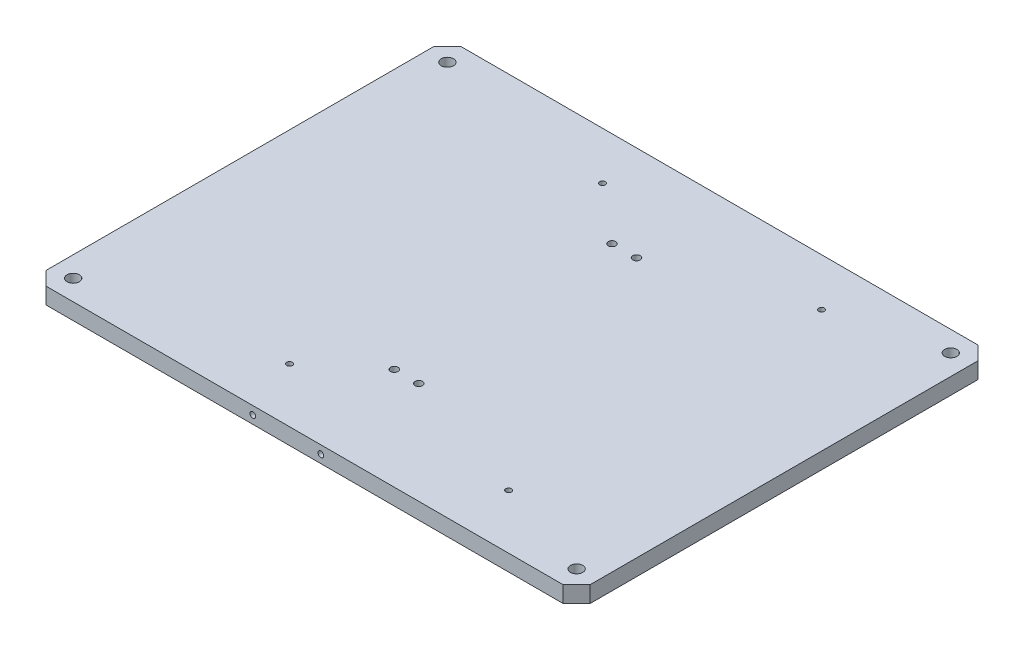
ISO-10303-21;
HEADER;
FILE_DESCRIPTION(('STEP AP214'),'2;1');
FILE_NAME('part.step','',(''),(''),'','','');
FILE_SCHEMA(('AUTOMOTIVE_DESIGN { 1 0 10303 214 1 1 1 1 }'));
ENDSEC;
DATA;
#1=APPLICATION_CONTEXT('core data for automotive mechanical design processes');
#2=APPLICATION_PROTOCOL_DEFINITION('international standard','automotive_design',2000,#1);
#3=PRODUCT_CONTEXT('',#1,'mechanical');
#4=PRODUCT('Part','Part','',(#3));
#5=PRODUCT_RELATED_PRODUCT_CATEGORY('part','',(#4));
#6=PRODUCT_DEFINITION_FORMATION('','',#4);
#7=PRODUCT_DEFINITION_CONTEXT('part definition',#1,'design');
#8=PRODUCT_DEFINITION('design','',#6,#7);
#9=PRODUCT_DEFINITION_SHAPE('','',#8);
#10=(LENGTH_UNIT() NAMED_UNIT(*) SI_UNIT(.MILLI.,.METRE.));
#11=(NAMED_UNIT(*) PLANE_ANGLE_UNIT() SI_UNIT($,.RADIAN.));
#12=(NAMED_UNIT(*) SI_UNIT($,.STERADIAN.) SOLID_ANGLE_UNIT());
#13=UNCERTAINTY_MEASURE_WITH_UNIT(LENGTH_MEASURE(1.E-05),#10,'distance_accuracy_value','');
#14=(GEOMETRIC_REPRESENTATION_CONTEXT(3) GLOBAL_UNCERTAINTY_ASSIGNED_CONTEXT((#13)) GLOBAL_UNIT_ASSIGNED_CONTEXT((#10,
#11,#12)) REPRESENTATION_CONTEXT('',''));
#15=CARTESIAN_POINT('',(0.,0.,0.));
#16=DIRECTION('',(0.,0.,1.));
#17=DIRECTION('',(1.,0.,0.));
#18=AXIS2_PLACEMENT_3D('',#15,#16,#17);
#19=CARTESIAN_POINT('',(-200.,12.,0.));
#20=DIRECTION('',(1.,0.,0.));
#21=DIRECTION('',(0.,0.,-1.));
#22=AXIS2_PLACEMENT_3D('',#19,#20,#21);
#23=PLANE('',#22);
#24=DIRECTION('',(0.,0.,1.));
#25=VECTOR('',#24,1.);
#26=CARTESIAN_POINT('',(-200.,0.,0.));
#27=LINE('',#26,#25);
#28=CARTESIAN_POINT('',(-200.,0.,10.0000000000001));
#29=VERTEX_POINT('',#28);
#30=CARTESIAN_POINT('',(-200.,0.,295.));
#31=VERTEX_POINT('',#30);
#32=EDGE_CURVE('E177',#29,#31,#27,.T.);
#33=ORIENTED_EDGE('',*,*,#32,.T.);
#34=DIRECTION('',(0.,1.,0.));
#35=VECTOR('',#34,1.);
#36=CARTESIAN_POINT('',(-200.,12.,295.));
#37=LINE('',#36,#35);
#38=CARTESIAN_POINT('',(-200.,12.,295.));
#39=VERTEX_POINT('',#38);
#40=EDGE_CURVE('E226',#31,#39,#37,.T.);
#41=ORIENTED_EDGE('',*,*,#40,.T.);
#42=DIRECTION('',(0.,0.,1.));
#43=VECTOR('',#42,1.);
#44=CARTESIAN_POINT('',(-200.,12.,0.));
#45=LINE('',#44,#43);
#46=CARTESIAN_POINT('',(-200.,12.,10.0000000000001));
#47=VERTEX_POINT('',#46);
#48=EDGE_CURVE('E178',#47,#39,#45,.T.);
#49=ORIENTED_EDGE('',*,*,#48,.F.);
#50=DIRECTION('',(0.,-1.,0.));
#51=VECTOR('',#50,1.);
#52=CARTESIAN_POINT('',(-200.,12.,10.0000000000001));
#53=LINE('',#52,#51);
#54=EDGE_CURVE('E223',#47,#29,#53,.T.);
#55=ORIENTED_EDGE('',*,*,#54,.T.);
#56=EDGE_LOOP('',(#33,#41,#49,#55));
#57=FACE_BOUND('',#56,.T.);
#58=ADVANCED_FACE('F36',(#57),#23,.F.);
#59=CARTESIAN_POINT('',(-200.,12.,305.));
#60=DIRECTION('',(0.,0.,-1.));
#61=DIRECTION('',(-1.,0.,0.));
#62=AXIS2_PLACEMENT_3D('',#59,#60,#61);
#63=PLANE('',#62);
#64=CARTESIAN_POINT('',(-38.,5.99999999999999,305.));
#65=DIRECTION('',(0.,0.,1.));
#66=DIRECTION('',(1.,0.,0.));
#67=AXIS2_PLACEMENT_3D('',#64,#65,#66);
#68=CIRCLE('',#67,2.09999999999999);
#69=CARTESIAN_POINT('',(-35.9,5.99999999999999,305.));
#70=VERTEX_POINT('',#69);
#71=EDGE_CURVE('E117',#70,#70,#68,.T.);
#72=ORIENTED_EDGE('',*,*,#71,.F.);
#73=EDGE_LOOP('',(#72));
#74=FACE_BOUND('',#73,.T.);
#75=CARTESIAN_POINT('',(12.0000000000001,6.,305.));
#76=DIRECTION('',(0.,0.,1.));
#77=DIRECTION('',(1.,0.,0.));
#78=AXIS2_PLACEMENT_3D('',#75,#76,#77);
#79=CIRCLE('',#78,2.09999999999999);
#80=CARTESIAN_POINT('',(14.1,6.,305.));
#81=VERTEX_POINT('',#80);
#82=EDGE_CURVE('E116',#81,#81,#79,.T.);
#83=ORIENTED_EDGE('',*,*,#82,.F.);
#84=EDGE_LOOP('',(#83));
#85=FACE_BOUND('',#84,.T.);
#86=DIRECTION('',(1.,0.,0.));
#87=VECTOR('',#86,1.);
#88=CARTESIAN_POINT('',(-200.,0.,305.));
#89=LINE('',#88,#87);
#90=CARTESIAN_POINT('',(-190.,0.,305.));
#91=VERTEX_POINT('',#90);
#92=CARTESIAN_POINT('',(190.,0.,305.));
#93=VERTEX_POINT('',#92);
#94=EDGE_CURVE('E192',#91,#93,#89,.T.);
#95=ORIENTED_EDGE('',*,*,#94,.T.);
#96=DIRECTION('',(0.,1.,0.));
#97=VECTOR('',#96,1.);
#98=CARTESIAN_POINT('',(190.,12.,305.));
#99=LINE('',#98,#97);
#100=CARTESIAN_POINT('',(190.,12.,305.));
#101=VERTEX_POINT('',#100);
#102=EDGE_CURVE('E214',#93,#101,#99,.T.);
#103=ORIENTED_EDGE('',*,*,#102,.T.);
#104=DIRECTION('',(1.,0.,0.));
#105=VECTOR('',#104,1.);
#106=CARTESIAN_POINT('',(-200.,12.,305.));
#107=LINE('',#106,#105);
#108=CARTESIAN_POINT('',(-190.,12.,305.));
#109=VERTEX_POINT('',#108);
#110=EDGE_CURVE('E181',#109,#101,#107,.T.);
#111=ORIENTED_EDGE('',*,*,#110,.F.);
#112=DIRECTION('',(0.,-1.,0.));
#113=VECTOR('',#112,1.);
#114=CARTESIAN_POINT('',(-190.,12.,305.));
#115=LINE('',#114,#113);
#116=EDGE_CURVE('E211',#109,#91,#115,.T.);
#117=ORIENTED_EDGE('',*,*,#116,.T.);
#118=EDGE_LOOP('',(#95,#103,#111,#117));
#119=FACE_BOUND('',#118,.T.);
#120=ADVANCED_FACE('F241',(#74,#85,#119),#63,.F.);
#121=CARTESIAN_POINT('',(200.,12.,0.));
#122=DIRECTION('',(-1.,0.,0.));
#123=DIRECTION('',(0.,0.,1.));
#124=AXIS2_PLACEMENT_3D('',#121,#122,#123);
#125=PLANE('',#124);
#126=DIRECTION('',(0.,0.,-1.));
#127=VECTOR('',#126,1.);
#128=CARTESIAN_POINT('',(200.,12.,0.));
#129=LINE('',#128,#127);
#130=CARTESIAN_POINT('',(200.,12.,295.));
#131=VERTEX_POINT('',#130);
#132=CARTESIAN_POINT('',(200.,12.,10.));
#133=VERTEX_POINT('',#132);
#134=EDGE_CURVE('E185',#131,#133,#129,.T.);
#135=ORIENTED_EDGE('',*,*,#134,.F.);
#136=DIRECTION('',(0.,-1.,0.));
#137=VECTOR('',#136,1.);
#138=CARTESIAN_POINT('',(200.,12.,295.));
#139=LINE('',#138,#137);
#140=CARTESIAN_POINT('',(200.,0.,295.));
#141=VERTEX_POINT('',#140);
#142=EDGE_CURVE('E200',#131,#141,#139,.T.);
#143=ORIENTED_EDGE('',*,*,#142,.T.);
#144=DIRECTION('',(0.,0.,-1.));
#145=VECTOR('',#144,1.);
#146=CARTESIAN_POINT('',(200.,0.,0.));
#147=LINE('',#146,#145);
#148=CARTESIAN_POINT('',(200.,0.,9.99999999999991));
#149=VERTEX_POINT('',#148);
#150=EDGE_CURVE('E195',#141,#149,#147,.T.);
#151=ORIENTED_EDGE('',*,*,#150,.T.);
#152=DIRECTION('',(0.,1.,0.));
#153=VECTOR('',#152,1.);
#154=CARTESIAN_POINT('',(200.,12.,9.99999999999991));
#155=LINE('',#154,#153);
#156=EDGE_CURVE('E189',#149,#133,#155,.T.);
#157=ORIENTED_EDGE('',*,*,#156,.T.);
#158=EDGE_LOOP('',(#135,#143,#151,#157));
#159=FACE_BOUND('',#158,.T.);
#160=ADVANCED_FACE('F252',(#159),#125,.F.);
#161=CARTESIAN_POINT('',(-200.,12.,0.));
#162=DIRECTION('',(0.,0.,1.));
#163=DIRECTION('',(1.,0.,0.));
#164=AXIS2_PLACEMENT_3D('',#161,#162,#163);
#165=PLANE('',#164);
#166=DIRECTION('',(-1.,0.,0.));
#167=VECTOR('',#166,1.);
#168=CARTESIAN_POINT('',(-200.,12.,0.));
#169=LINE('',#168,#167);
#170=CARTESIAN_POINT('',(190.,12.,0.));
#171=VERTEX_POINT('',#170);
#172=CARTESIAN_POINT('',(-190.,12.,0.));
#173=VERTEX_POINT('',#172);
#174=EDGE_CURVE('E187',#171,#173,#169,.T.);
#175=ORIENTED_EDGE('',*,*,#174,.F.);
#176=DIRECTION('',(0.,-1.,0.));
#177=VECTOR('',#176,1.);
#178=CARTESIAN_POINT('',(190.,12.,0.));
#179=LINE('',#178,#177);
#180=CARTESIAN_POINT('',(190.,0.,0.));
#181=VERTEX_POINT('',#180);
#182=EDGE_CURVE('E11',#171,#181,#179,.T.);
#183=ORIENTED_EDGE('',*,*,#182,.T.);
#184=DIRECTION('',(-1.,0.,0.));
#185=VECTOR('',#184,1.);
#186=CARTESIAN_POINT('',(-200.,0.,0.));
#187=LINE('',#186,#185);
#188=CARTESIAN_POINT('',(-190.,0.,0.));
#189=VERTEX_POINT('',#188);
#190=EDGE_CURVE('E182',#181,#189,#187,.T.);
#191=ORIENTED_EDGE('',*,*,#190,.T.);
#192=DIRECTION('',(0.,1.,0.));
#193=VECTOR('',#192,1.);
#194=CARTESIAN_POINT('',(-190.,12.,0.));
#195=LINE('',#194,#193);
#196=EDGE_CURVE('E44',#189,#173,#195,.T.);
#197=ORIENTED_EDGE('',*,*,#196,.T.);
#198=EDGE_LOOP('',(#175,#183,#191,#197));
#199=FACE_BOUND('',#198,.T.);
#200=ADVANCED_FACE('F258',(#199),#165,.F.);
#201=CARTESIAN_POINT('',(-200.,12.,305.));
#202=DIRECTION('',(0.,1.,0.));
#203=DIRECTION('',(0.,0.,1.));
#204=AXIS2_PLACEMENT_3D('',#201,#202,#203);
#205=PLANE('',#204);
#206=CARTESIAN_POINT('',(-51.,12.,265.));
#207=DIRECTION('',(0.,1.,0.));
#208=DIRECTION('',(0.,0.,1.));
#209=AXIS2_PLACEMENT_3D('',#206,#207,#208);
#210=CIRCLE('',#209,2.1);
#211=CARTESIAN_POINT('',(-51.,12.,267.1));
#212=VERTEX_POINT('',#211);
#213=EDGE_CURVE('E639',#212,#212,#210,.T.);
#214=ORIENTED_EDGE('',*,*,#213,.F.);
#215=EDGE_LOOP('',(#214));
#216=FACE_BOUND('',#215,.T.);
#217=CARTESIAN_POINT('',(-51.,12.,35.));
#218=DIRECTION('',(0.,1.,0.));
#219=DIRECTION('',(0.,0.,1.));
#220=AXIS2_PLACEMENT_3D('',#217,#218,#219);
#221=CIRCLE('',#220,2.1);
#222=CARTESIAN_POINT('',(-51.,12.,37.1));
#223=VERTEX_POINT('',#222);
#224=EDGE_CURVE('E641',#223,#223,#221,.T.);
#225=ORIENTED_EDGE('',*,*,#224,.F.);
#226=EDGE_LOOP('',(#225));
#227=FACE_BOUND('',#226,.T.);
#228=CARTESIAN_POINT('',(110.,12.,265.));
#229=DIRECTION('',(0.,1.,0.));
#230=DIRECTION('',(0.,0.,1.));
#231=AXIS2_PLACEMENT_3D('',#228,#229,#230);
#232=CIRCLE('',#231,2.1);
#233=CARTESIAN_POINT('',(110.,12.,267.1));
#234=VERTEX_POINT('',#233);
#235=EDGE_CURVE('E649',#234,#234,#232,.T.);
#236=ORIENTED_EDGE('',*,*,#235,.F.);
#237=EDGE_LOOP('',(#236));
#238=FACE_BOUND('',#237,.T.);
#239=CARTESIAN_POINT('',(110.,12.,35.));
#240=DIRECTION('',(0.,1.,0.));
#241=DIRECTION('',(0.,0.,1.));
#242=AXIS2_PLACEMENT_3D('',#239,#240,#241);
#243=CIRCLE('',#242,2.1);
#244=CARTESIAN_POINT('',(110.,12.,37.1));
#245=VERTEX_POINT('',#244);
#246=EDGE_CURVE('E655',#245,#245,#243,.T.);
#247=ORIENTED_EDGE('',*,*,#246,.F.);
#248=EDGE_LOOP('',(#247));
#249=FACE_BOUND('',#248,.T.);
#250=CARTESIAN_POINT('',(-185.,12.,290.));
#251=DIRECTION('',(0.,1.,0.));
#252=DIRECTION('',(0.,0.,1.));
#253=AXIS2_PLACEMENT_3D('',#250,#251,#252);
#254=CIRCLE('',#253,4.49999999999998);
#255=CARTESIAN_POINT('',(-185.,12.,294.5));
#256=VERTEX_POINT('',#255);
#257=EDGE_CURVE('E661',#256,#256,#254,.T.);
#258=ORIENTED_EDGE('',*,*,#257,.F.);
#259=EDGE_LOOP('',(#258));
#260=FACE_BOUND('',#259,.T.);
#261=CARTESIAN_POINT('',(-185.,12.,15.));
#262=DIRECTION('',(0.,1.,0.));
#263=DIRECTION('',(0.,0.,1.));
#264=AXIS2_PLACEMENT_3D('',#261,#262,#263);
#265=CIRCLE('',#264,4.49999999999998);
#266=CARTESIAN_POINT('',(-185.,12.,19.4999999999999));
#267=VERTEX_POINT('',#266);
#268=EDGE_CURVE('E667',#267,#267,#265,.T.);
#269=ORIENTED_EDGE('',*,*,#268,.F.);
#270=EDGE_LOOP('',(#269));
#271=FACE_BOUND('',#270,.T.);
#272=CARTESIAN_POINT('',(185.,12.,15.));
#273=DIRECTION('',(0.,1.,0.));
#274=DIRECTION('',(0.,0.,1.));
#275=AXIS2_PLACEMENT_3D('',#272,#273,#274);
#276=CIRCLE('',#275,4.49999999999998);
#277=CARTESIAN_POINT('',(185.,12.,19.5));
#278=VERTEX_POINT('',#277);
#279=EDGE_CURVE('E673',#278,#278,#276,.T.);
#280=ORIENTED_EDGE('',*,*,#279,.F.);
#281=EDGE_LOOP('',(#280));
#282=FACE_BOUND('',#281,.T.);
#283=CARTESIAN_POINT('',(185.,12.,290.));
#284=DIRECTION('',(0.,1.,0.));
#285=DIRECTION('',(0.,0.,1.));
#286=AXIS2_PLACEMENT_3D('',#283,#284,#285);
#287=CIRCLE('',#286,4.49999999999998);
#288=CARTESIAN_POINT('',(185.,12.,294.5));
#289=VERTEX_POINT('',#288);
#290=EDGE_CURVE('E679',#289,#289,#287,.T.);
#291=ORIENTED_EDGE('',*,*,#290,.F.);
#292=EDGE_LOOP('',(#291));
#293=FACE_BOUND('',#292,.T.);
#294=CARTESIAN_POINT('',(-9.00000000000003,12.,230.));
#295=DIRECTION('',(0.,-1.,0.));
#296=DIRECTION('',(0.,0.,-1.));
#297=AXIS2_PLACEMENT_3D('',#294,#295,#296);
#298=CIRCLE('',#297,2.75);
#299=CARTESIAN_POINT('',(-9.00000000000003,12.,227.25));
#300=VERTEX_POINT('',#299);
#301=EDGE_CURVE('E138',#300,#300,#298,.T.);
#302=ORIENTED_EDGE('',*,*,#301,.T.);
#303=EDGE_LOOP('',(#302));
#304=FACE_BOUND('',#303,.T.);
#305=CARTESIAN_POINT('',(-9.00000000000003,12.,70.));
#306=DIRECTION('',(0.,-1.,0.));
#307=DIRECTION('',(0.,0.,-1.));
#308=AXIS2_PLACEMENT_3D('',#305,#306,#307);
#309=CIRCLE('',#308,2.75);
#310=CARTESIAN_POINT('',(-9.00000000000003,12.,67.25));
#311=VERTEX_POINT('',#310);
#312=EDGE_CURVE('E150',#311,#311,#309,.T.);
#313=ORIENTED_EDGE('',*,*,#312,.T.);
#314=EDGE_LOOP('',(#313));
#315=FACE_BOUND('',#314,.T.);
#316=CARTESIAN_POINT('',(9.00000000000001,12.,70.));
#317=DIRECTION('',(0.,-1.,0.));
#318=DIRECTION('',(0.,0.,-1.));
#319=AXIS2_PLACEMENT_3D('',#316,#317,#318);
#320=CIRCLE('',#319,2.75);
#321=CARTESIAN_POINT('',(9.00000000000001,12.,67.25));
#322=VERTEX_POINT('',#321);
#323=EDGE_CURVE('E162',#322,#322,#320,.T.);
#324=ORIENTED_EDGE('',*,*,#323,.T.);
#325=EDGE_LOOP('',(#324));
#326=FACE_BOUND('',#325,.T.);
#327=CARTESIAN_POINT('',(8.99999999999997,12.,230.));
#328=DIRECTION('',(0.,-1.,0.));
#329=DIRECTION('',(0.,0.,-1.));
#330=AXIS2_PLACEMENT_3D('',#327,#328,#329);
#331=CIRCLE('',#330,2.75);
#332=CARTESIAN_POINT('',(8.99999999999997,12.,227.25));
#333=VERTEX_POINT('',#332);
#334=EDGE_CURVE('E174',#333,#333,#331,.T.);
#335=ORIENTED_EDGE('',*,*,#334,.T.);
#336=EDGE_LOOP('',(#335));
#337=FACE_BOUND('',#336,.T.);
#338=ORIENTED_EDGE('',*,*,#110,.T.);
#339=DIRECTION('',(-0.707106781186551,0.,0.707106781186544));
#340=VECTOR('',#339,1.);
#341=CARTESIAN_POINT('',(-5.00000000000211,12.,500.));
#342=LINE('',#341,#340);
#343=EDGE_CURVE('E221',#101,#131,#342,.F.);
#344=ORIENTED_EDGE('',*,*,#343,.T.);
#345=ORIENTED_EDGE('',*,*,#134,.T.);
#346=DIRECTION('',(0.707106781186548,0.,0.707106781186548));
#347=VECTOR('',#346,1.);
#348=CARTESIAN_POINT('',(147.5,12.,-42.5));
#349=LINE('',#348,#347);
#350=EDGE_CURVE('E57',#133,#171,#349,.F.);
#351=ORIENTED_EDGE('',*,*,#350,.T.);
#352=ORIENTED_EDGE('',*,*,#174,.T.);
#353=DIRECTION('',(0.707106781186546,0.,-0.707106781186549));
#354=VECTOR('',#353,1.);
#355=CARTESIAN_POINT('',(-347.5,12.,157.500000000001));
#356=LINE('',#355,#354);
#357=EDGE_CURVE('E216',#173,#47,#356,.F.);
#358=ORIENTED_EDGE('',*,*,#357,.T.);
#359=ORIENTED_EDGE('',*,*,#48,.T.);
#360=DIRECTION('',(-0.707106781186549,0.,-0.707106781186546));
#361=VECTOR('',#360,1.);
#362=CARTESIAN_POINT('',(-195.,12.,300.));
#363=LINE('',#362,#361);
#364=EDGE_CURVE('E219',#39,#109,#363,.F.);
#365=ORIENTED_EDGE('',*,*,#364,.T.);
#366=EDGE_LOOP('',(#338,#344,#345,#351,#352,#358,#359,#365));
#367=FACE_BOUND('',#366,.T.);
#368=ADVANCED_FACE('F234',(#216,#227,#238,#249,#260,#271,#282,#293,#304,#315,#326,#337,#367),
#205,.T.);
#369=CARTESIAN_POINT('',(-200.,0.,305.));
#370=DIRECTION('',(0.,1.,0.));
#371=DIRECTION('',(0.,0.,1.));
#372=AXIS2_PLACEMENT_3D('',#369,#370,#371);
#373=PLANE('',#372);
#374=CARTESIAN_POINT('',(-51.,0.,265.));
#375=DIRECTION('',(0.,1.,0.));
#376=DIRECTION('',(0.,0.,1.));
#377=AXIS2_PLACEMENT_3D('',#374,#375,#376);
#378=CIRCLE('',#377,2.1);
#379=CARTESIAN_POINT('',(-51.,0.,267.1));
#380=VERTEX_POINT('',#379);
#381=EDGE_CURVE('E636',#380,#380,#378,.T.);
#382=ORIENTED_EDGE('',*,*,#381,.T.);
#383=EDGE_LOOP('',(#382));
#384=FACE_BOUND('',#383,.T.);
#385=CARTESIAN_POINT('',(-51.,0.,35.));
#386=DIRECTION('',(0.,1.,0.));
#387=DIRECTION('',(0.,0.,1.));
#388=AXIS2_PLACEMENT_3D('',#385,#386,#387);
#389=CIRCLE('',#388,2.1);
#390=CARTESIAN_POINT('',(-51.,0.,37.1));
#391=VERTEX_POINT('',#390);
#392=EDGE_CURVE('E646',#391,#391,#389,.T.);
#393=ORIENTED_EDGE('',*,*,#392,.T.);
#394=EDGE_LOOP('',(#393));
#395=FACE_BOUND('',#394,.T.);
#396=CARTESIAN_POINT('',(110.,0.,265.));
#397=DIRECTION('',(0.,1.,0.));
#398=DIRECTION('',(0.,0.,1.));
#399=AXIS2_PLACEMENT_3D('',#396,#397,#398);
#400=CIRCLE('',#399,2.09999999999999);
#401=CARTESIAN_POINT('',(110.,0.,267.1));
#402=VERTEX_POINT('',#401);
#403=EDGE_CURVE('E652',#402,#402,#400,.T.);
#404=ORIENTED_EDGE('',*,*,#403,.T.);
#405=EDGE_LOOP('',(#404));
#406=FACE_BOUND('',#405,.T.);
#407=CARTESIAN_POINT('',(110.,0.,35.));
#408=DIRECTION('',(0.,1.,0.));
#409=DIRECTION('',(0.,0.,1.));
#410=AXIS2_PLACEMENT_3D('',#407,#408,#409);
#411=CIRCLE('',#410,2.09999999999999);
#412=CARTESIAN_POINT('',(110.,0.,37.1));
#413=VERTEX_POINT('',#412);
#414=EDGE_CURVE('E658',#413,#413,#411,.T.);
#415=ORIENTED_EDGE('',*,*,#414,.T.);
#416=EDGE_LOOP('',(#415));
#417=FACE_BOUND('',#416,.T.);
#418=CARTESIAN_POINT('',(-185.,0.,290.));
#419=DIRECTION('',(0.,1.,0.));
#420=DIRECTION('',(0.,0.,1.));
#421=AXIS2_PLACEMENT_3D('',#418,#419,#420);
#422=CIRCLE('',#421,4.5);
#423=CARTESIAN_POINT('',(-185.,0.,294.5));
#424=VERTEX_POINT('',#423);
#425=EDGE_CURVE('E664',#424,#424,#422,.T.);
#426=ORIENTED_EDGE('',*,*,#425,.T.);
#427=EDGE_LOOP('',(#426));
#428=FACE_BOUND('',#427,.T.);
#429=CARTESIAN_POINT('',(-185.,0.,15.));
#430=DIRECTION('',(0.,1.,0.));
#431=DIRECTION('',(0.,0.,1.));
#432=AXIS2_PLACEMENT_3D('',#429,#430,#431);
#433=CIRCLE('',#432,4.5);
#434=CARTESIAN_POINT('',(-185.,0.,19.5));
#435=VERTEX_POINT('',#434);
#436=EDGE_CURVE('E670',#435,#435,#433,.T.);
#437=ORIENTED_EDGE('',*,*,#436,.T.);
#438=EDGE_LOOP('',(#437));
#439=FACE_BOUND('',#438,.T.);
#440=CARTESIAN_POINT('',(185.,0.,15.));
#441=DIRECTION('',(0.,1.,0.));
#442=DIRECTION('',(0.,0.,1.));
#443=AXIS2_PLACEMENT_3D('',#440,#441,#442);
#444=CIRCLE('',#443,4.5);
#445=CARTESIAN_POINT('',(185.,0.,19.5));
#446=VERTEX_POINT('',#445);
#447=EDGE_CURVE('E676',#446,#446,#444,.T.);
#448=ORIENTED_EDGE('',*,*,#447,.T.);
#449=EDGE_LOOP('',(#448));
#450=FACE_BOUND('',#449,.T.);
#451=CARTESIAN_POINT('',(185.,0.,290.));
#452=DIRECTION('',(0.,1.,0.));
#453=DIRECTION('',(0.,0.,1.));
#454=AXIS2_PLACEMENT_3D('',#451,#452,#453);
#455=CIRCLE('',#454,4.5);
#456=CARTESIAN_POINT('',(185.,0.,294.5));
#457=VERTEX_POINT('',#456);
#458=EDGE_CURVE('E123',#457,#457,#455,.T.);
#459=ORIENTED_EDGE('',*,*,#458,.T.);
#460=EDGE_LOOP('',(#459));
#461=FACE_BOUND('',#460,.T.);
#462=CARTESIAN_POINT('',(-9.00000000000003,0.,230.));
#463=DIRECTION('',(0.,-1.,0.));
#464=DIRECTION('',(0.,0.,-1.));
#465=AXIS2_PLACEMENT_3D('',#462,#463,#464);
#466=CIRCLE('',#465,5.);
#467=CARTESIAN_POINT('',(-9.00000000000003,0.,225.));
#468=VERTEX_POINT('',#467);
#469=EDGE_CURVE('E129',#468,#468,#466,.T.);
#470=ORIENTED_EDGE('',*,*,#469,.F.);
#471=EDGE_LOOP('',(#470));
#472=FACE_BOUND('',#471,.T.);
#473=CARTESIAN_POINT('',(-9.00000000000003,0.,70.));
#474=DIRECTION('',(0.,-1.,0.));
#475=DIRECTION('',(0.,0.,-1.));
#476=AXIS2_PLACEMENT_3D('',#473,#474,#475);
#477=CIRCLE('',#476,5.);
#478=CARTESIAN_POINT('',(-9.00000000000003,0.,65.));
#479=VERTEX_POINT('',#478);
#480=EDGE_CURVE('E141',#479,#479,#477,.T.);
#481=ORIENTED_EDGE('',*,*,#480,.F.);
#482=EDGE_LOOP('',(#481));
#483=FACE_BOUND('',#482,.T.);
#484=CARTESIAN_POINT('',(9.00000000000001,0.,70.));
#485=DIRECTION('',(0.,-1.,0.));
#486=DIRECTION('',(0.,0.,-1.));
#487=AXIS2_PLACEMENT_3D('',#484,#485,#486);
#488=CIRCLE('',#487,5.);
#489=CARTESIAN_POINT('',(9.00000000000001,0.,65.));
#490=VERTEX_POINT('',#489);
#491=EDGE_CURVE('E153',#490,#490,#488,.T.);
#492=ORIENTED_EDGE('',*,*,#491,.F.);
#493=EDGE_LOOP('',(#492));
#494=FACE_BOUND('',#493,.T.);
#495=CARTESIAN_POINT('',(8.99999999999997,0.,230.));
#496=DIRECTION('',(0.,-1.,0.));
#497=DIRECTION('',(0.,0.,-1.));
#498=AXIS2_PLACEMENT_3D('',#495,#496,#497);
#499=CIRCLE('',#498,5.);
#500=CARTESIAN_POINT('',(8.99999999999997,0.,225.));
#501=VERTEX_POINT('',#500);
#502=EDGE_CURVE('E165',#501,#501,#499,.T.);
#503=ORIENTED_EDGE('',*,*,#502,.F.);
#504=EDGE_LOOP('',(#503));
#505=FACE_BOUND('',#504,.T.);
#506=ORIENTED_EDGE('',*,*,#150,.F.);
#507=DIRECTION('',(0.707106781186551,0.,-0.707106781186544));
#508=VECTOR('',#507,1.);
#509=CARTESIAN_POINT('',(200.,0.,295.));
#510=LINE('',#509,#508);
#511=EDGE_CURVE('E209',#141,#93,#510,.F.);
#512=ORIENTED_EDGE('',*,*,#511,.T.);
#513=ORIENTED_EDGE('',*,*,#94,.F.);
#514=DIRECTION('',(0.707106781186549,0.,0.707106781186546));
#515=VECTOR('',#514,1.);
#516=CARTESIAN_POINT('',(-190.,0.,305.));
#517=LINE('',#516,#515);
#518=EDGE_CURVE('E207',#91,#31,#517,.F.);
#519=ORIENTED_EDGE('',*,*,#518,.T.);
#520=ORIENTED_EDGE('',*,*,#32,.F.);
#521=DIRECTION('',(-0.707106781186546,0.,0.707106781186549));
#522=VECTOR('',#521,1.);
#523=CARTESIAN_POINT('',(-200.,0.,10.0000000000001));
#524=LINE('',#523,#522);
#525=EDGE_CURVE('E203',#29,#189,#524,.F.);
#526=ORIENTED_EDGE('',*,*,#525,.T.);
#527=ORIENTED_EDGE('',*,*,#190,.F.);
#528=DIRECTION('',(-0.707106781186548,0.,-0.707106781186548));
#529=VECTOR('',#528,1.);
#530=CARTESIAN_POINT('',(190.,0.,0.));
#531=LINE('',#530,#529);
#532=EDGE_CURVE('E205',#181,#149,#531,.F.);
#533=ORIENTED_EDGE('',*,*,#532,.T.);
#534=EDGE_LOOP('',(#506,#512,#513,#519,#520,#526,#527,#533));
#535=FACE_BOUND('',#534,.T.);
#536=ADVANCED_FACE('F245',(#384,#395,#406,#417,#428,#439,#450,#461,#472,#483,#494,#505,#535),
#373,.F.);
#537=CARTESIAN_POINT('',(8.99999999999997,0.,230.));
#538=DIRECTION('',(0.,-1.,0.));
#539=DIRECTION('',(0.,0.,-1.));
#540=AXIS2_PLACEMENT_3D('',#537,#538,#539);
#541=CYLINDRICAL_SURFACE('',#540,2.75);
#542=ORIENTED_EDGE('',*,*,#334,.F.);
#543=EDGE_LOOP('',(#542));
#544=FACE_BOUND('',#543,.T.);
#545=CARTESIAN_POINT('',(8.99999999999997,5.,230.));
#546=DIRECTION('',(0.,-1.,0.));
#547=DIRECTION('',(0.,0.,-1.));
#548=AXIS2_PLACEMENT_3D('',#545,#546,#547);
#549=CIRCLE('',#548,2.75);
#550=CARTESIAN_POINT('',(8.99999999999997,5.,227.25));
#551=VERTEX_POINT('',#550);
#552=EDGE_CURVE('E171',#551,#551,#549,.T.);
#553=ORIENTED_EDGE('',*,*,#552,.T.);
#554=EDGE_LOOP('',(#553));
#555=FACE_BOUND('',#554,.T.);
#556=ADVANCED_FACE('F352',(#544,#555),#541,.F.);
#557=CARTESIAN_POINT('',(11.75,5.,230.));
#558=DIRECTION('',(0.,1.,0.));
#559=DIRECTION('',(0.,0.,1.));
#560=AXIS2_PLACEMENT_3D('',#557,#558,#559);
#561=PLANE('',#560);
#562=ORIENTED_EDGE('',*,*,#552,.F.);
#563=EDGE_LOOP('',(#562));
#564=FACE_BOUND('',#563,.T.);
#565=CARTESIAN_POINT('',(8.99999999999997,5.,230.));
#566=DIRECTION('',(0.,-1.,0.));
#567=DIRECTION('',(0.,0.,-1.));
#568=AXIS2_PLACEMENT_3D('',#565,#566,#567);
#569=CIRCLE('',#568,5.);
#570=CARTESIAN_POINT('',(8.99999999999997,5.,225.));
#571=VERTEX_POINT('',#570);
#572=EDGE_CURVE('E168',#571,#571,#569,.T.);
#573=ORIENTED_EDGE('',*,*,#572,.T.);
#574=EDGE_LOOP('',(#573));
#575=FACE_BOUND('',#574,.T.);
#576=ADVANCED_FACE('F455',(#564,#575),#561,.F.);
#577=CARTESIAN_POINT('',(8.99999999999997,0.,230.));
#578=DIRECTION('',(0.,-1.,0.));
#579=DIRECTION('',(0.,0.,-1.));
#580=AXIS2_PLACEMENT_3D('',#577,#578,#579);
#581=CYLINDRICAL_SURFACE('',#580,5.);
#582=ORIENTED_EDGE('',*,*,#572,.F.);
#583=EDGE_LOOP('',(#582));
#584=FACE_BOUND('',#583,.T.);
#585=ORIENTED_EDGE('',*,*,#502,.T.);
#586=EDGE_LOOP('',(#585));
#587=FACE_BOUND('',#586,.T.);
#588=ADVANCED_FACE('F451',(#584,#587),#581,.F.);
#589=CARTESIAN_POINT('',(9.00000000000001,0.,70.));
#590=DIRECTION('',(0.,-1.,0.));
#591=DIRECTION('',(0.,0.,-1.));
#592=AXIS2_PLACEMENT_3D('',#589,#590,#591);
#593=CYLINDRICAL_SURFACE('',#592,2.75);
#594=ORIENTED_EDGE('',*,*,#323,.F.);
#595=EDGE_LOOP('',(#594));
#596=FACE_BOUND('',#595,.T.);
#597=CARTESIAN_POINT('',(9.00000000000001,5.,70.));
#598=DIRECTION('',(0.,-1.,0.));
#599=DIRECTION('',(0.,0.,-1.));
#600=AXIS2_PLACEMENT_3D('',#597,#598,#599);
#601=CIRCLE('',#600,2.75);
#602=CARTESIAN_POINT('',(9.00000000000001,5.,67.25));
#603=VERTEX_POINT('',#602);
#604=EDGE_CURVE('E159',#603,#603,#601,.T.);
#605=ORIENTED_EDGE('',*,*,#604,.T.);
#606=EDGE_LOOP('',(#605));
#607=FACE_BOUND('',#606,.T.);
#608=ADVANCED_FACE('F447',(#596,#607),#593,.F.);
#609=CARTESIAN_POINT('',(11.75,5.,70.));
#610=DIRECTION('',(0.,1.,0.));
#611=DIRECTION('',(0.,0.,1.));
#612=AXIS2_PLACEMENT_3D('',#609,#610,#611);
#613=PLANE('',#612);
#614=ORIENTED_EDGE('',*,*,#604,.F.);
#615=EDGE_LOOP('',(#614));
#616=FACE_BOUND('',#615,.T.);
#617=CARTESIAN_POINT('',(9.00000000000001,5.,70.));
#618=DIRECTION('',(0.,-1.,0.));
#619=DIRECTION('',(0.,0.,-1.));
#620=AXIS2_PLACEMENT_3D('',#617,#618,#619);
#621=CIRCLE('',#620,5.);
#622=CARTESIAN_POINT('',(9.00000000000001,5.,65.));
#623=VERTEX_POINT('',#622);
#624=EDGE_CURVE('E156',#623,#623,#621,.T.);
#625=ORIENTED_EDGE('',*,*,#624,.T.);
#626=EDGE_LOOP('',(#625));
#627=FACE_BOUND('',#626,.T.);
#628=ADVANCED_FACE('F443',(#616,#627),#613,.F.);
#629=CARTESIAN_POINT('',(9.00000000000001,0.,70.));
#630=DIRECTION('',(0.,-1.,0.));
#631=DIRECTION('',(0.,0.,-1.));
#632=AXIS2_PLACEMENT_3D('',#629,#630,#631);
#633=CYLINDRICAL_SURFACE('',#632,5.);
#634=ORIENTED_EDGE('',*,*,#624,.F.);
#635=EDGE_LOOP('',(#634));
#636=FACE_BOUND('',#635,.T.);
#637=ORIENTED_EDGE('',*,*,#491,.T.);
#638=EDGE_LOOP('',(#637));
#639=FACE_BOUND('',#638,.T.);
#640=ADVANCED_FACE('F439',(#636,#639),#633,.F.);
#641=CARTESIAN_POINT('',(-9.00000000000003,0.,70.));
#642=DIRECTION('',(0.,-1.,0.));
#643=DIRECTION('',(0.,0.,-1.));
#644=AXIS2_PLACEMENT_3D('',#641,#642,#643);
#645=CYLINDRICAL_SURFACE('',#644,2.75);
#646=ORIENTED_EDGE('',*,*,#312,.F.);
#647=EDGE_LOOP('',(#646));
#648=FACE_BOUND('',#647,.T.);
#649=CARTESIAN_POINT('',(-9.00000000000003,5.,70.));
#650=DIRECTION('',(0.,-1.,0.));
#651=DIRECTION('',(0.,0.,-1.));
#652=AXIS2_PLACEMENT_3D('',#649,#650,#651);
#653=CIRCLE('',#652,2.75);
#654=CARTESIAN_POINT('',(-9.00000000000003,5.,67.25));
#655=VERTEX_POINT('',#654);
#656=EDGE_CURVE('E147',#655,#655,#653,.T.);
#657=ORIENTED_EDGE('',*,*,#656,.T.);
#658=EDGE_LOOP('',(#657));
#659=FACE_BOUND('',#658,.T.);
#660=ADVANCED_FACE('F435',(#648,#659),#645,.F.);
#661=CARTESIAN_POINT('',(-6.25000000000003,5.,70.));
#662=DIRECTION('',(0.,1.,0.));
#663=DIRECTION('',(0.,0.,1.));
#664=AXIS2_PLACEMENT_3D('',#661,#662,#663);
#665=PLANE('',#664);
#666=ORIENTED_EDGE('',*,*,#656,.F.);
#667=EDGE_LOOP('',(#666));
#668=FACE_BOUND('',#667,.T.);
#669=CARTESIAN_POINT('',(-9.00000000000003,5.,70.));
#670=DIRECTION('',(0.,-1.,0.));
#671=DIRECTION('',(0.,0.,-1.));
#672=AXIS2_PLACEMENT_3D('',#669,#670,#671);
#673=CIRCLE('',#672,5.);
#674=CARTESIAN_POINT('',(-9.00000000000003,5.,65.));
#675=VERTEX_POINT('',#674);
#676=EDGE_CURVE('E144',#675,#675,#673,.T.);
#677=ORIENTED_EDGE('',*,*,#676,.T.);
#678=EDGE_LOOP('',(#677));
#679=FACE_BOUND('',#678,.T.);
#680=ADVANCED_FACE('F431',(#668,#679),#665,.F.);
#681=CARTESIAN_POINT('',(-9.00000000000003,0.,70.));
#682=DIRECTION('',(0.,-1.,0.));
#683=DIRECTION('',(0.,0.,-1.));
#684=AXIS2_PLACEMENT_3D('',#681,#682,#683);
#685=CYLINDRICAL_SURFACE('',#684,5.);
#686=ORIENTED_EDGE('',*,*,#676,.F.);
#687=EDGE_LOOP('',(#686));
#688=FACE_BOUND('',#687,.T.);
#689=ORIENTED_EDGE('',*,*,#480,.T.);
#690=EDGE_LOOP('',(#689));
#691=FACE_BOUND('',#690,.T.);
#692=ADVANCED_FACE('F427',(#688,#691),#685,.F.);
#693=CARTESIAN_POINT('',(-9.00000000000003,0.,230.));
#694=DIRECTION('',(0.,-1.,0.));
#695=DIRECTION('',(0.,0.,-1.));
#696=AXIS2_PLACEMENT_3D('',#693,#694,#695);
#697=CYLINDRICAL_SURFACE('',#696,2.75);
#698=ORIENTED_EDGE('',*,*,#301,.F.);
#699=EDGE_LOOP('',(#698));
#700=FACE_BOUND('',#699,.T.);
#701=CARTESIAN_POINT('',(-9.00000000000003,5.,230.));
#702=DIRECTION('',(0.,-1.,0.));
#703=DIRECTION('',(0.,0.,-1.));
#704=AXIS2_PLACEMENT_3D('',#701,#702,#703);
#705=CIRCLE('',#704,2.75);
#706=CARTESIAN_POINT('',(-9.00000000000003,5.,227.25));
#707=VERTEX_POINT('',#706);
#708=EDGE_CURVE('E135',#707,#707,#705,.T.);
#709=ORIENTED_EDGE('',*,*,#708,.T.);
#710=EDGE_LOOP('',(#709));
#711=FACE_BOUND('',#710,.T.);
#712=ADVANCED_FACE('F423',(#700,#711),#697,.F.);
#713=CARTESIAN_POINT('',(-6.25000000000003,5.,230.));
#714=DIRECTION('',(0.,1.,0.));
#715=DIRECTION('',(0.,0.,1.));
#716=AXIS2_PLACEMENT_3D('',#713,#714,#715);
#717=PLANE('',#716);
#718=ORIENTED_EDGE('',*,*,#708,.F.);
#719=EDGE_LOOP('',(#718));
#720=FACE_BOUND('',#719,.T.);
#721=CARTESIAN_POINT('',(-9.00000000000003,5.,230.));
#722=DIRECTION('',(0.,-1.,0.));
#723=DIRECTION('',(0.,0.,-1.));
#724=AXIS2_PLACEMENT_3D('',#721,#722,#723);
#725=CIRCLE('',#724,5.);
#726=CARTESIAN_POINT('',(-9.00000000000003,5.,225.));
#727=VERTEX_POINT('',#726);
#728=EDGE_CURVE('E132',#727,#727,#725,.T.);
#729=ORIENTED_EDGE('',*,*,#728,.T.);
#730=EDGE_LOOP('',(#729));
#731=FACE_BOUND('',#730,.T.);
#732=ADVANCED_FACE('F419',(#720,#731),#717,.F.);
#733=CARTESIAN_POINT('',(-9.00000000000003,0.,230.));
#734=DIRECTION('',(0.,-1.,0.));
#735=DIRECTION('',(0.,0.,-1.));
#736=AXIS2_PLACEMENT_3D('',#733,#734,#735);
#737=CYLINDRICAL_SURFACE('',#736,5.);
#738=ORIENTED_EDGE('',*,*,#728,.F.);
#739=EDGE_LOOP('',(#738));
#740=FACE_BOUND('',#739,.T.);
#741=ORIENTED_EDGE('',*,*,#469,.T.);
#742=EDGE_LOOP('',(#741));
#743=FACE_BOUND('',#742,.T.);
#744=ADVANCED_FACE('F415',(#740,#743),#737,.F.);
#745=CARTESIAN_POINT('',(12.0000000000001,6.,291.));
#746=DIRECTION('',(0.,0.,1.));
#747=DIRECTION('',(1.,0.,0.));
#748=AXIS2_PLACEMENT_3D('',#745,#746,#747);
#749=CONICAL_SURFACE('',#748,2.09999999999999,1.02974425867666);
#750=CARTESIAN_POINT('',(12.,6.,289.738192700042));
#751=VERTEX_POINT('',#750);
#752=VERTEX_LOOP('',#751);
#753=FACE_BOUND('',#752,.T.);
#754=CARTESIAN_POINT('',(12.0000000000001,6.,291.));
#755=DIRECTION('',(0.,0.,1.));
#756=DIRECTION('',(1.,0.,0.));
#757=AXIS2_PLACEMENT_3D('',#754,#755,#756);
#758=CIRCLE('',#757,2.09999999999999);
#759=CARTESIAN_POINT('',(14.1,6.,291.));
#760=VERTEX_POINT('',#759);
#761=EDGE_CURVE('E120',#760,#760,#758,.T.);
#762=ORIENTED_EDGE('',*,*,#761,.T.);
#763=EDGE_LOOP('',(#762));
#764=FACE_BOUND('',#763,.T.);
#765=ADVANCED_FACE('F411',(#753,#764),#749,.F.);
#766=CARTESIAN_POINT('',(12.0000000000001,6.,305.));
#767=DIRECTION('',(0.,0.,1.));
#768=DIRECTION('',(1.,0.,0.));
#769=AXIS2_PLACEMENT_3D('',#766,#767,#768);
#770=CYLINDRICAL_SURFACE('',#769,2.09999999999999);
#771=ORIENTED_EDGE('',*,*,#761,.F.);
#772=EDGE_LOOP('',(#771));
#773=FACE_BOUND('',#772,.T.);
#774=ORIENTED_EDGE('',*,*,#82,.T.);
#775=EDGE_LOOP('',(#774));
#776=FACE_BOUND('',#775,.T.);
#777=ADVANCED_FACE('F110',(#773,#776),#770,.F.);
#778=CARTESIAN_POINT('',(-38.,5.99999999999999,291.));
#779=DIRECTION('',(0.,0.,1.));
#780=DIRECTION('',(1.,0.,0.));
#781=AXIS2_PLACEMENT_3D('',#778,#779,#780);
#782=CONICAL_SURFACE('',#781,2.09999999999999,1.02974425867666);
#783=CARTESIAN_POINT('',(-38.,5.99999999999999,289.738192700042));
#784=VERTEX_POINT('',#783);
#785=VERTEX_LOOP('',#784);
#786=FACE_BOUND('',#785,.T.);
#787=CARTESIAN_POINT('',(-38.,5.99999999999999,291.));
#788=DIRECTION('',(0.,0.,1.));
#789=DIRECTION('',(1.,0.,0.));
#790=AXIS2_PLACEMENT_3D('',#787,#788,#789);
#791=CIRCLE('',#790,2.09999999999999);
#792=CARTESIAN_POINT('',(-35.9,5.99999999999999,291.));
#793=VERTEX_POINT('',#792);
#794=EDGE_CURVE('E114',#793,#793,#791,.T.);
#795=ORIENTED_EDGE('',*,*,#794,.T.);
#796=EDGE_LOOP('',(#795));
#797=FACE_BOUND('',#796,.T.);
#798=ADVANCED_FACE('F106',(#786,#797),#782,.F.);
#799=CARTESIAN_POINT('',(-38.,5.99999999999999,305.));
#800=DIRECTION('',(0.,0.,1.));
#801=DIRECTION('',(1.,0.,0.));
#802=AXIS2_PLACEMENT_3D('',#799,#800,#801);
#803=CYLINDRICAL_SURFACE('',#802,2.09999999999999);
#804=ORIENTED_EDGE('',*,*,#794,.F.);
#805=EDGE_LOOP('',(#804));
#806=FACE_BOUND('',#805,.T.);
#807=ORIENTED_EDGE('',*,*,#71,.T.);
#808=EDGE_LOOP('',(#807));
#809=FACE_BOUND('',#808,.T.);
#810=ADVANCED_FACE('F109',(#806,#809),#803,.F.);
#811=CARTESIAN_POINT('',(200.,12.,295.));
#812=DIRECTION('',(-0.707106781186543,0.,-0.707106781186551));
#813=DIRECTION('',(-0.707106781186551,0.,0.707106781186544));
#814=AXIS2_PLACEMENT_3D('',#811,#812,#813);
#815=PLANE('',#814);
#816=ORIENTED_EDGE('',*,*,#343,.F.);
#817=ORIENTED_EDGE('',*,*,#102,.F.);
#818=ORIENTED_EDGE('',*,*,#511,.F.);
#819=ORIENTED_EDGE('',*,*,#142,.F.);
#820=EDGE_LOOP('',(#816,#817,#818,#819));
#821=FACE_BOUND('',#820,.T.);
#822=ADVANCED_FACE('F249',(#821),#815,.F.);
#823=CARTESIAN_POINT('',(-190.,12.,305.));
#824=DIRECTION('',(0.707106781186545,0.,-0.707106781186549));
#825=DIRECTION('',(-0.707106781186549,0.,-0.707106781186546));
#826=AXIS2_PLACEMENT_3D('',#823,#824,#825);
#827=PLANE('',#826);
#828=ORIENTED_EDGE('',*,*,#364,.F.);
#829=ORIENTED_EDGE('',*,*,#40,.F.);
#830=ORIENTED_EDGE('',*,*,#518,.F.);
#831=ORIENTED_EDGE('',*,*,#116,.F.);
#832=EDGE_LOOP('',(#828,#829,#830,#831));
#833=FACE_BOUND('',#832,.T.);
#834=ADVANCED_FACE('F238',(#833),#827,.F.);
#835=CARTESIAN_POINT('',(190.,12.,0.));
#836=DIRECTION('',(-0.707106781186548,0.,0.707106781186548));
#837=DIRECTION('',(0.707106781186548,0.,0.707106781186548));
#838=AXIS2_PLACEMENT_3D('',#835,#836,#837);
#839=PLANE('',#838);
#840=ORIENTED_EDGE('',*,*,#350,.F.);
#841=ORIENTED_EDGE('',*,*,#156,.F.);
#842=ORIENTED_EDGE('',*,*,#532,.F.);
#843=ORIENTED_EDGE('',*,*,#182,.F.);
#844=EDGE_LOOP('',(#840,#841,#842,#843));
#845=FACE_BOUND('',#844,.T.);
#846=ADVANCED_FACE('F256',(#845),#839,.F.);
#847=CARTESIAN_POINT('',(-200.,12.,10.0000000000001));
#848=DIRECTION('',(0.707106781186549,0.,0.707106781186545));
#849=DIRECTION('',(0.707106781186546,0.,-0.707106781186549));
#850=AXIS2_PLACEMENT_3D('',#847,#848,#849);
#851=PLANE('',#850);
#852=ORIENTED_EDGE('',*,*,#357,.F.);
#853=ORIENTED_EDGE('',*,*,#196,.F.);
#854=ORIENTED_EDGE('',*,*,#525,.F.);
#855=ORIENTED_EDGE('',*,*,#54,.F.);
#856=EDGE_LOOP('',(#852,#853,#854,#855));
#857=FACE_BOUND('',#856,.T.);
#858=ADVANCED_FACE('F38',(#857),#851,.F.);
#859=CARTESIAN_POINT('',(185.,12.,290.));
#860=DIRECTION('',(0.,1.,0.));
#861=DIRECTION('',(0.,0.,1.));
#862=AXIS2_PLACEMENT_3D('',#859,#860,#861);
#863=CYLINDRICAL_SURFACE('',#862,4.49999999999999);
#864=ORIENTED_EDGE('',*,*,#458,.F.);
#865=EDGE_LOOP('',(#864));
#866=FACE_BOUND('',#865,.T.);
#867=ORIENTED_EDGE('',*,*,#290,.T.);
#868=EDGE_LOOP('',(#867));
#869=FACE_BOUND('',#868,.T.);
#870=ADVANCED_FACE('F261',(#866,#869),#863,.F.);
#871=CARTESIAN_POINT('',(185.,12.,15.));
#872=DIRECTION('',(0.,1.,0.));
#873=DIRECTION('',(0.,0.,1.));
#874=AXIS2_PLACEMENT_3D('',#871,#872,#873);
#875=CYLINDRICAL_SURFACE('',#874,4.49999999999999);
#876=ORIENTED_EDGE('',*,*,#447,.F.);
#877=EDGE_LOOP('',(#876));
#878=FACE_BOUND('',#877,.T.);
#879=ORIENTED_EDGE('',*,*,#279,.T.);
#880=EDGE_LOOP('',(#879));
#881=FACE_BOUND('',#880,.T.);
#882=ADVANCED_FACE('F266',(#878,#881),#875,.F.);
#883=CARTESIAN_POINT('',(-185.,12.,15.));
#884=DIRECTION('',(0.,1.,0.));
#885=DIRECTION('',(0.,0.,1.));
#886=AXIS2_PLACEMENT_3D('',#883,#884,#885);
#887=CYLINDRICAL_SURFACE('',#886,4.49999999999999);
#888=ORIENTED_EDGE('',*,*,#436,.F.);
#889=EDGE_LOOP('',(#888));
#890=FACE_BOUND('',#889,.T.);
#891=ORIENTED_EDGE('',*,*,#268,.T.);
#892=EDGE_LOOP('',(#891));
#893=FACE_BOUND('',#892,.T.);
#894=ADVANCED_FACE('F309',(#890,#893),#887,.F.);
#895=CARTESIAN_POINT('',(-185.,12.,290.));
#896=DIRECTION('',(0.,1.,0.));
#897=DIRECTION('',(0.,0.,1.));
#898=AXIS2_PLACEMENT_3D('',#895,#896,#897);
#899=CYLINDRICAL_SURFACE('',#898,4.49999999999999);
#900=ORIENTED_EDGE('',*,*,#425,.F.);
#901=EDGE_LOOP('',(#900));
#902=FACE_BOUND('',#901,.T.);
#903=ORIENTED_EDGE('',*,*,#257,.T.);
#904=EDGE_LOOP('',(#903));
#905=FACE_BOUND('',#904,.T.);
#906=ADVANCED_FACE('F319',(#902,#905),#899,.F.);
#907=CARTESIAN_POINT('',(110.,12.,35.));
#908=DIRECTION('',(0.,1.,0.));
#909=DIRECTION('',(0.,0.,1.));
#910=AXIS2_PLACEMENT_3D('',#907,#908,#909);
#911=CYLINDRICAL_SURFACE('',#910,2.1);
#912=ORIENTED_EDGE('',*,*,#414,.F.);
#913=EDGE_LOOP('',(#912));
#914=FACE_BOUND('',#913,.T.);
#915=ORIENTED_EDGE('',*,*,#246,.T.);
#916=EDGE_LOOP('',(#915));
#917=FACE_BOUND('',#916,.T.);
#918=ADVANCED_FACE('F329',(#914,#917),#911,.F.);
#919=CARTESIAN_POINT('',(110.,12.,265.));
#920=DIRECTION('',(0.,1.,0.));
#921=DIRECTION('',(0.,0.,1.));
#922=AXIS2_PLACEMENT_3D('',#919,#920,#921);
#923=CYLINDRICAL_SURFACE('',#922,2.1);
#924=ORIENTED_EDGE('',*,*,#403,.F.);
#925=EDGE_LOOP('',(#924));
#926=FACE_BOUND('',#925,.T.);
#927=ORIENTED_EDGE('',*,*,#235,.T.);
#928=EDGE_LOOP('',(#927));
#929=FACE_BOUND('',#928,.T.);
#930=ADVANCED_FACE('F363',(#926,#929),#923,.F.);
#931=CARTESIAN_POINT('',(-51.,12.,35.));
#932=DIRECTION('',(0.,1.,0.));
#933=DIRECTION('',(0.,0.,1.));
#934=AXIS2_PLACEMENT_3D('',#931,#932,#933);
#935=CYLINDRICAL_SURFACE('',#934,2.1);
#936=ORIENTED_EDGE('',*,*,#392,.F.);
#937=EDGE_LOOP('',(#936));
#938=FACE_BOUND('',#937,.T.);
#939=ORIENTED_EDGE('',*,*,#224,.T.);
#940=EDGE_LOOP('',(#939));
#941=FACE_BOUND('',#940,.T.);
#942=ADVANCED_FACE('F375',(#938,#941),#935,.F.);
#943=CARTESIAN_POINT('',(-51.,12.,265.));
#944=DIRECTION('',(0.,1.,0.));
#945=DIRECTION('',(0.,0.,1.));
#946=AXIS2_PLACEMENT_3D('',#943,#944,#945);
#947=CYLINDRICAL_SURFACE('',#946,2.1);
#948=ORIENTED_EDGE('',*,*,#381,.F.);
#949=EDGE_LOOP('',(#948));
#950=FACE_BOUND('',#949,.T.);
#951=ORIENTED_EDGE('',*,*,#213,.T.);
#952=EDGE_LOOP('',(#951));
#953=FACE_BOUND('',#952,.T.);
#954=ADVANCED_FACE('F386',(#950,#953),#947,.F.);
#955=CLOSED_SHELL('',(#58,#120,#160,#200,#368,#536,#556,#576,#588,#608,#628,#640,#660,#680,#692,
#712,#732,#744,#765,#777,#798,#810,#822,#834,#846,#858,#870,#882,#894,#906,#918,#930,#942,#954));
#956=MANIFOLD_SOLID_BREP('B2',#955);
#957=ADVANCED_BREP_SHAPE_REPRESENTATION('',(#18,#956),#14);
#958=SHAPE_DEFINITION_REPRESENTATION(#9,#957);
ENDSEC;
END-ISO-10303-21;
